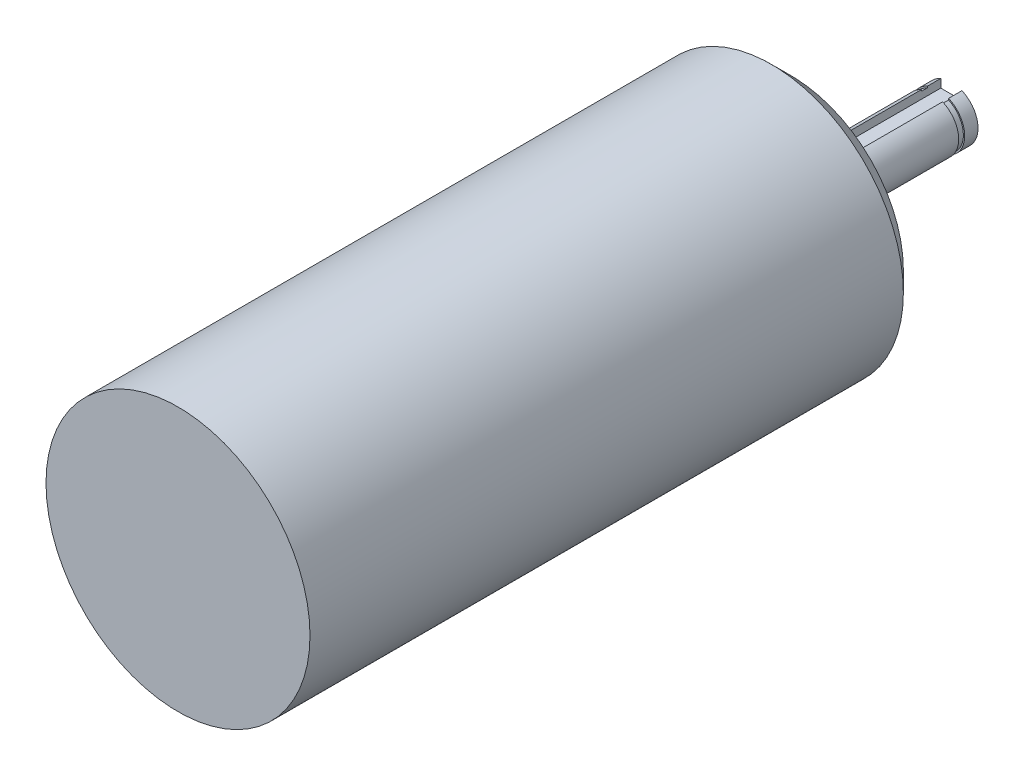
ISO-10303-21;
HEADER;
FILE_DESCRIPTION(('STEP AP214'),'2;1');
FILE_NAME('part.step','',(''),(''),'','','');
FILE_SCHEMA(('AUTOMOTIVE_DESIGN { 1 0 10303 214 1 1 1 1 }'));
ENDSEC;
DATA;
#1=APPLICATION_CONTEXT('core data for automotive mechanical design processes');
#2=APPLICATION_PROTOCOL_DEFINITION('international standard','automotive_design',2000,#1);
#3=PRODUCT_CONTEXT('',#1,'mechanical');
#4=PRODUCT('Part','Part','',(#3));
#5=PRODUCT_RELATED_PRODUCT_CATEGORY('part','',(#4));
#6=PRODUCT_DEFINITION_FORMATION('','',#4);
#7=PRODUCT_DEFINITION_CONTEXT('part definition',#1,'design');
#8=PRODUCT_DEFINITION('design','',#6,#7);
#9=PRODUCT_DEFINITION_SHAPE('','',#8);
#10=(LENGTH_UNIT() NAMED_UNIT(*) SI_UNIT(.MILLI.,.METRE.));
#11=(NAMED_UNIT(*) PLANE_ANGLE_UNIT() SI_UNIT($,.RADIAN.));
#12=(NAMED_UNIT(*) SI_UNIT($,.STERADIAN.) SOLID_ANGLE_UNIT());
#13=UNCERTAINTY_MEASURE_WITH_UNIT(LENGTH_MEASURE(1.E-05),#10,'distance_accuracy_value','');
#14=(GEOMETRIC_REPRESENTATION_CONTEXT(3) GLOBAL_UNCERTAINTY_ASSIGNED_CONTEXT((#13)) GLOBAL_UNIT_ASSIGNED_CONTEXT((#10,
#11,#12)) REPRESENTATION_CONTEXT('',''));
#15=CARTESIAN_POINT('',(0.,0.,0.));
#16=DIRECTION('',(0.,0.,1.));
#17=DIRECTION('',(1.,0.,0.));
#18=AXIS2_PLACEMENT_3D('',#15,#16,#17);
#19=CARTESIAN_POINT('',(0.,0.,-24.));
#20=DIRECTION('',(0.,0.,1.));
#21=DIRECTION('',(1.,0.,0.));
#22=AXIS2_PLACEMENT_3D('',#19,#20,#21);
#23=CYLINDRICAL_SURFACE('',#22,4.);
#24=CARTESIAN_POINT('',(0.,0.,0.));
#25=DIRECTION('',(0.,0.,-1.));
#26=DIRECTION('',(-1.,0.,0.));
#27=AXIS2_PLACEMENT_3D('',#24,#25,#26);
#28=CIRCLE('',#27,4.);
#29=CARTESIAN_POINT('',(-4.,0.,0.));
#30=VERTEX_POINT('',#29);
#31=EDGE_CURVE('E182',#30,#30,#28,.T.);
#32=ORIENTED_EDGE('',*,*,#31,.T.);
#33=EDGE_LOOP('',(#32));
#34=FACE_BOUND('',#33,.T.);
#35=CARTESIAN_POINT('',(0.,0.,-21.1));
#36=DIRECTION('',(0.,0.,-1.));
#37=DIRECTION('',(-1.,0.,0.));
#38=AXIS2_PLACEMENT_3D('',#35,#36,#37);
#39=CIRCLE('',#38,4.);
#40=CARTESIAN_POINT('',(1.5875,3.67149067137586,-21.1));
#41=VERTEX_POINT('',#40);
#42=CARTESIAN_POINT('',(-1.5875,3.67149067137586,-21.1));
#43=VERTEX_POINT('',#42);
#44=EDGE_CURVE('E128',#41,#43,#39,.T.);
#45=ORIENTED_EDGE('',*,*,#44,.F.);
#46=DIRECTION('',(0.,0.,1.));
#47=VECTOR('',#46,1.);
#48=CARTESIAN_POINT('',(1.5875,3.67149067137587,-24.));
#49=LINE('',#48,#47);
#50=CARTESIAN_POINT('',(1.5875,3.67149067137586,-5.));
#51=VERTEX_POINT('',#50);
#52=EDGE_CURVE('E166',#41,#51,#49,.T.);
#53=ORIENTED_EDGE('',*,*,#52,.T.);
#54=CARTESIAN_POINT('',(0.,0.,-5.));
#55=DIRECTION('',(0.,0.,1.));
#56=DIRECTION('',(1.,0.,0.));
#57=AXIS2_PLACEMENT_3D('',#54,#55,#56);
#58=CIRCLE('',#57,4.);
#59=CARTESIAN_POINT('',(-1.5875,3.67149067137586,-5.));
#60=VERTEX_POINT('',#59);
#61=EDGE_CURVE('E163',#51,#60,#58,.T.);
#62=ORIENTED_EDGE('',*,*,#61,.T.);
#63=DIRECTION('',(0.,0.,1.));
#64=VECTOR('',#63,1.);
#65=CARTESIAN_POINT('',(-1.5875,3.67149067137586,-24.));
#66=LINE('',#65,#64);
#67=EDGE_CURVE('E172',#60,#43,#66,.F.);
#68=ORIENTED_EDGE('',*,*,#67,.T.);
#69=EDGE_LOOP('',(#45,#53,#62,#68));
#70=FACE_BOUND('',#69,.T.);
#71=ADVANCED_FACE('F44',(#34,#70),#23,.T.);
#72=CARTESIAN_POINT('',(-1.5875,2.4125,-5.));
#73=DIRECTION('',(-1.,0.,0.));
#74=DIRECTION('',(0.,0.,1.));
#75=AXIS2_PLACEMENT_3D('',#72,#73,#74);
#76=PLANE('',#75);
#77=DIRECTION('',(0.,-1.,0.));
#78=VECTOR('',#77,1.);
#79=CARTESIAN_POINT('',(-1.5875,2.4125,-21.1));
#80=LINE('',#79,#78);
#81=CARTESIAN_POINT('',(-1.5875,3.45251267195357,-21.1));
#82=VERTEX_POINT('',#81);
#83=EDGE_CURVE('E123',#43,#82,#80,.T.);
#84=ORIENTED_EDGE('',*,*,#83,.F.);
#85=ORIENTED_EDGE('',*,*,#67,.F.);
#86=DIRECTION('',(0.,1.,0.));
#87=VECTOR('',#86,1.);
#88=CARTESIAN_POINT('',(-1.5875,2.4125,-5.));
#89=LINE('',#88,#87);
#90=CARTESIAN_POINT('',(-1.5875,2.4125,-5.));
#91=VERTEX_POINT('',#90);
#92=EDGE_CURVE('E151',#91,#60,#89,.T.);
#93=ORIENTED_EDGE('',*,*,#92,.F.);
#94=DIRECTION('',(0.,0.,-1.));
#95=VECTOR('',#94,1.);
#96=CARTESIAN_POINT('',(-1.5875,2.4125,-5.));
#97=LINE('',#96,#95);
#98=CARTESIAN_POINT('',(-1.5875,2.4125,-24.));
#99=VERTEX_POINT('',#98);
#100=EDGE_CURVE('E170',#91,#99,#97,.T.);
#101=ORIENTED_EDGE('',*,*,#100,.T.);
#102=DIRECTION('',(0.,1.,0.));
#103=VECTOR('',#102,1.);
#104=CARTESIAN_POINT('',(-1.5875,2.4125,-24.));
#105=LINE('',#104,#103);
#106=CARTESIAN_POINT('',(-1.5875,3.67149067137586,-24.));
#107=VERTEX_POINT('',#106);
#108=EDGE_CURVE('E134',#99,#107,#105,.T.);
#109=ORIENTED_EDGE('',*,*,#108,.T.);
#110=CARTESIAN_POINT('',(-1.5875,3.67149067137586,-22.));
#111=VERTEX_POINT('',#110);
#112=EDGE_CURVE('E174',#111,#107,#66,.F.);
#113=ORIENTED_EDGE('',*,*,#112,.F.);
#114=DIRECTION('',(0.,-1.,0.));
#115=VECTOR('',#114,1.);
#116=CARTESIAN_POINT('',(-1.5875,2.4125,-22.));
#117=LINE('',#116,#115);
#118=CARTESIAN_POINT('',(-1.5875,3.45251267195357,-22.));
#119=VERTEX_POINT('',#118);
#120=EDGE_CURVE('E132',#111,#119,#117,.T.);
#121=ORIENTED_EDGE('',*,*,#120,.T.);
#122=DIRECTION('',(0.,0.,-1.));
#123=VECTOR('',#122,1.);
#124=CARTESIAN_POINT('',(-1.5875,3.45251267195357,-21.1));
#125=LINE('',#124,#123);
#126=EDGE_CURVE('E139',#82,#119,#125,.T.);
#127=ORIENTED_EDGE('',*,*,#126,.F.);
#128=EDGE_LOOP('',(#84,#85,#93,#101,#109,#113,#121,#127));
#129=FACE_BOUND('',#128,.T.);
#130=ADVANCED_FACE('F145',(#129),#76,.F.);
#131=CARTESIAN_POINT('',(1.5875,2.4125,-5.));
#132=DIRECTION('',(1.,0.,0.));
#133=DIRECTION('',(0.,0.,-1.));
#134=AXIS2_PLACEMENT_3D('',#131,#132,#133);
#135=PLANE('',#134);
#136=DIRECTION('',(0.,1.,0.));
#137=VECTOR('',#136,1.);
#138=CARTESIAN_POINT('',(1.5875,2.4125,-21.1));
#139=LINE('',#138,#137);
#140=CARTESIAN_POINT('',(1.5875,3.45251267195357,-21.1));
#141=VERTEX_POINT('',#140);
#142=EDGE_CURVE('E11',#141,#41,#139,.T.);
#143=ORIENTED_EDGE('',*,*,#142,.F.);
#144=DIRECTION('',(0.,0.,-1.));
#145=VECTOR('',#144,1.);
#146=CARTESIAN_POINT('',(1.5875,3.45251267195357,-21.1));
#147=LINE('',#146,#145);
#148=CARTESIAN_POINT('',(1.5875,3.45251267195357,-22.));
#149=VERTEX_POINT('',#148);
#150=EDGE_CURVE('E140',#149,#141,#147,.F.);
#151=ORIENTED_EDGE('',*,*,#150,.F.);
#152=DIRECTION('',(0.,1.,0.));
#153=VECTOR('',#152,1.);
#154=CARTESIAN_POINT('',(1.5875,2.4125,-22.));
#155=LINE('',#154,#153);
#156=CARTESIAN_POINT('',(1.5875,3.67149067137586,-22.));
#157=VERTEX_POINT('',#156);
#158=EDGE_CURVE('E53',#149,#157,#155,.T.);
#159=ORIENTED_EDGE('',*,*,#158,.T.);
#160=CARTESIAN_POINT('',(1.5875,3.67149067137586,-24.));
#161=VERTEX_POINT('',#160);
#162=EDGE_CURVE('E173',#161,#157,#49,.T.);
#163=ORIENTED_EDGE('',*,*,#162,.F.);
#164=DIRECTION('',(0.,-1.,0.));
#165=VECTOR('',#164,1.);
#166=CARTESIAN_POINT('',(1.5875,2.4125,-24.));
#167=LINE('',#166,#165);
#168=CARTESIAN_POINT('',(1.5875,2.4125,-24.));
#169=VERTEX_POINT('',#168);
#170=EDGE_CURVE('E165',#161,#169,#167,.T.);
#171=ORIENTED_EDGE('',*,*,#170,.T.);
#172=DIRECTION('',(0.,0.,-1.));
#173=VECTOR('',#172,1.);
#174=CARTESIAN_POINT('',(1.5875,2.4125,-5.));
#175=LINE('',#174,#173);
#176=CARTESIAN_POINT('',(1.5875,2.4125,-5.));
#177=VERTEX_POINT('',#176);
#178=EDGE_CURVE('E68',#177,#169,#175,.T.);
#179=ORIENTED_EDGE('',*,*,#178,.F.);
#180=DIRECTION('',(0.,-1.,0.));
#181=VECTOR('',#180,1.);
#182=CARTESIAN_POINT('',(1.5875,2.4125,-5.));
#183=LINE('',#182,#181);
#184=EDGE_CURVE('E152',#51,#177,#183,.T.);
#185=ORIENTED_EDGE('',*,*,#184,.F.);
#186=ORIENTED_EDGE('',*,*,#52,.F.);
#187=EDGE_LOOP('',(#143,#151,#159,#163,#171,#179,#185,#186));
#188=FACE_BOUND('',#187,.T.);
#189=ADVANCED_FACE('F231',(#188),#135,.F.);
#190=CARTESIAN_POINT('',(0.,0.,92.));
#191=DIRECTION('',(0.,0.,-1.));
#192=DIRECTION('',(-1.,0.,0.));
#193=AXIS2_PLACEMENT_3D('',#190,#191,#192);
#194=CYLINDRICAL_SURFACE('',#193,19.8);
#195=CARTESIAN_POINT('',(0.,0.,3.00000000000002));
#196=DIRECTION('',(0.,0.,1.));
#197=DIRECTION('',(1.,0.,0.));
#198=AXIS2_PLACEMENT_3D('',#195,#196,#197);
#199=CIRCLE('',#198,19.8);
#200=CARTESIAN_POINT('',(19.8,0.,3.00000000000002));
#201=VERTEX_POINT('',#200);
#202=EDGE_CURVE('E184',#201,#201,#199,.T.);
#203=ORIENTED_EDGE('',*,*,#202,.T.);
#204=EDGE_LOOP('',(#203));
#205=FACE_BOUND('',#204,.T.);
#206=CARTESIAN_POINT('',(0.,0.,92.));
#207=DIRECTION('',(0.,0.,1.));
#208=DIRECTION('',(1.,0.,0.));
#209=AXIS2_PLACEMENT_3D('',#206,#207,#208);
#210=CIRCLE('',#209,19.8);
#211=CARTESIAN_POINT('',(19.8,0.,92.));
#212=VERTEX_POINT('',#211);
#213=EDGE_CURVE('E183',#212,#212,#210,.T.);
#214=ORIENTED_EDGE('',*,*,#213,.F.);
#215=EDGE_LOOP('',(#214));
#216=FACE_BOUND('',#215,.T.);
#217=ADVANCED_FACE('F322',(#205,#216),#194,.T.);
#218=CARTESIAN_POINT('',(0.,0.,92.));
#219=DIRECTION('',(0.,0.,1.));
#220=DIRECTION('',(1.,0.,0.));
#221=AXIS2_PLACEMENT_3D('',#218,#219,#220);
#222=PLANE('',#221);
#223=ORIENTED_EDGE('',*,*,#213,.T.);
#224=EDGE_LOOP('',(#223));
#225=FACE_BOUND('',#224,.T.);
#226=ADVANCED_FACE('F321',(#225),#222,.T.);
#227=CARTESIAN_POINT('',(0.,0.,0.));
#228=DIRECTION('',(0.,0.,1.));
#229=DIRECTION('',(1.,0.,0.));
#230=AXIS2_PLACEMENT_3D('',#227,#228,#229);
#231=PLANE('',#230);
#232=CARTESIAN_POINT('',(0.,0.,0.));
#233=DIRECTION('',(0.,0.,1.));
#234=DIRECTION('',(1.,0.,0.));
#235=AXIS2_PLACEMENT_3D('',#232,#233,#234);
#236=CIRCLE('',#235,16.8);
#237=CARTESIAN_POINT('',(16.8,0.,0.));
#238=VERTEX_POINT('',#237);
#239=EDGE_CURVE('E164',#238,#238,#236,.F.);
#240=ORIENTED_EDGE('',*,*,#239,.T.);
#241=EDGE_LOOP('',(#240));
#242=FACE_BOUND('',#241,.T.);
#243=ORIENTED_EDGE('',*,*,#31,.F.);
#244=EDGE_LOOP('',(#243));
#245=FACE_BOUND('',#244,.T.);
#246=CARTESIAN_POINT('',(0.,12.5,0.));
#247=DIRECTION('',(0.,0.,-1.));
#248=DIRECTION('',(-1.,0.,0.));
#249=AXIS2_PLACEMENT_3D('',#246,#247,#248);
#250=CIRCLE('',#249,2.025);
#251=CARTESIAN_POINT('',(-2.025,12.5,0.));
#252=VERTEX_POINT('',#251);
#253=EDGE_CURVE('E180',#252,#252,#250,.T.);
#254=ORIENTED_EDGE('',*,*,#253,.F.);
#255=EDGE_LOOP('',(#254));
#256=FACE_BOUND('',#255,.T.);
#257=CARTESIAN_POINT('',(12.5,0.,0.));
#258=DIRECTION('',(0.,0.,-1.));
#259=DIRECTION('',(-1.,0.,0.));
#260=AXIS2_PLACEMENT_3D('',#257,#258,#259);
#261=CIRCLE('',#260,2.025);
#262=CARTESIAN_POINT('',(10.475,0.,0.));
#263=VERTEX_POINT('',#262);
#264=EDGE_CURVE('E193',#263,#263,#261,.T.);
#265=ORIENTED_EDGE('',*,*,#264,.F.);
#266=EDGE_LOOP('',(#265));
#267=FACE_BOUND('',#266,.T.);
#268=CARTESIAN_POINT('',(0.,-12.5,0.));
#269=DIRECTION('',(0.,0.,-1.));
#270=DIRECTION('',(-1.,0.,0.));
#271=AXIS2_PLACEMENT_3D('',#268,#269,#270);
#272=CIRCLE('',#271,2.025);
#273=CARTESIAN_POINT('',(-2.025,-12.5,0.));
#274=VERTEX_POINT('',#273);
#275=EDGE_CURVE('E201',#274,#274,#272,.T.);
#276=ORIENTED_EDGE('',*,*,#275,.F.);
#277=EDGE_LOOP('',(#276));
#278=FACE_BOUND('',#277,.T.);
#279=CARTESIAN_POINT('',(-12.5,0.,0.));
#280=DIRECTION('',(0.,0.,-1.));
#281=DIRECTION('',(-1.,0.,0.));
#282=AXIS2_PLACEMENT_3D('',#279,#280,#281);
#283=CIRCLE('',#282,2.025);
#284=CARTESIAN_POINT('',(-14.525,0.,0.));
#285=VERTEX_POINT('',#284);
#286=EDGE_CURVE('E215',#285,#285,#283,.T.);
#287=ORIENTED_EDGE('',*,*,#286,.F.);
#288=EDGE_LOOP('',(#287));
#289=FACE_BOUND('',#288,.T.);
#290=ADVANCED_FACE('F317',(#242,#245,#256,#267,#278,#289),#231,.F.);
#291=CARTESIAN_POINT('',(-12.5,0.,4.));
#292=DIRECTION('',(0.,0.,-1.));
#293=DIRECTION('',(-1.,0.,0.));
#294=AXIS2_PLACEMENT_3D('',#291,#292,#293);
#295=CONICAL_SURFACE('',#294,1.65,1.02974425867665);
#296=CARTESIAN_POINT('',(-12.5,0.,4.99142002139547));
#297=VERTEX_POINT('',#296);
#298=VERTEX_LOOP('',#297);
#299=FACE_BOUND('',#298,.T.);
#300=CARTESIAN_POINT('',(-12.5,0.,4.));
#301=DIRECTION('',(0.,0.,-1.));
#302=DIRECTION('',(-1.,0.,0.));
#303=AXIS2_PLACEMENT_3D('',#300,#301,#302);
#304=CIRCLE('',#303,1.65);
#305=CARTESIAN_POINT('',(-14.15,0.,4.));
#306=VERTEX_POINT('',#305);
#307=EDGE_CURVE('E217',#306,#306,#304,.T.);
#308=ORIENTED_EDGE('',*,*,#307,.T.);
#309=EDGE_LOOP('',(#308));
#310=FACE_BOUND('',#309,.T.);
#311=ADVANCED_FACE('F312',(#299,#310),#295,.F.);
#312=CARTESIAN_POINT('',(-12.5,0.,0.));
#313=DIRECTION('',(0.,0.,-1.));
#314=DIRECTION('',(-1.,0.,0.));
#315=AXIS2_PLACEMENT_3D('',#312,#313,#314);
#316=CYLINDRICAL_SURFACE('',#315,1.65);
#317=ORIENTED_EDGE('',*,*,#307,.F.);
#318=EDGE_LOOP('',(#317));
#319=FACE_BOUND('',#318,.T.);
#320=CARTESIAN_POINT('',(-12.5,0.,0.375000000000001));
#321=DIRECTION('',(0.,0.,-1.));
#322=DIRECTION('',(-1.,0.,0.));
#323=AXIS2_PLACEMENT_3D('',#320,#321,#322);
#324=CIRCLE('',#323,1.65);
#325=CARTESIAN_POINT('',(-14.15,0.,0.375000000000001));
#326=VERTEX_POINT('',#325);
#327=EDGE_CURVE('E214',#326,#326,#324,.T.);
#328=ORIENTED_EDGE('',*,*,#327,.T.);
#329=EDGE_LOOP('',(#328));
#330=FACE_BOUND('',#329,.T.);
#331=ADVANCED_FACE('F313',(#319,#330),#316,.F.);
#332=CARTESIAN_POINT('',(-12.5,0.,0.));
#333=DIRECTION('',(0.,0.,-1.));
#334=DIRECTION('',(-1.,0.,0.));
#335=AXIS2_PLACEMENT_3D('',#332,#333,#334);
#336=CONICAL_SURFACE('',#335,2.025,0.785398163397448);
#337=ORIENTED_EDGE('',*,*,#327,.F.);
#338=EDGE_LOOP('',(#337));
#339=FACE_BOUND('',#338,.T.);
#340=ORIENTED_EDGE('',*,*,#286,.T.);
#341=EDGE_LOOP('',(#340));
#342=FACE_BOUND('',#341,.T.);
#343=ADVANCED_FACE('F307',(#339,#342),#336,.F.);
#344=CARTESIAN_POINT('',(0.,-12.5,4.));
#345=DIRECTION('',(0.,0.,-1.));
#346=DIRECTION('',(-1.,0.,0.));
#347=AXIS2_PLACEMENT_3D('',#344,#345,#346);
#348=CONICAL_SURFACE('',#347,1.65,1.02974425867665);
#349=CARTESIAN_POINT('',(0.,-12.5,4.99142002139547));
#350=VERTEX_POINT('',#349);
#351=VERTEX_LOOP('',#350);
#352=FACE_BOUND('',#351,.T.);
#353=CARTESIAN_POINT('',(0.,-12.5,4.));
#354=DIRECTION('',(0.,0.,-1.));
#355=DIRECTION('',(-1.,0.,0.));
#356=AXIS2_PLACEMENT_3D('',#353,#354,#355);
#357=CIRCLE('',#356,1.65);
#358=CARTESIAN_POINT('',(-1.65,-12.5,4.));
#359=VERTEX_POINT('',#358);
#360=EDGE_CURVE('E207',#359,#359,#357,.T.);
#361=ORIENTED_EDGE('',*,*,#360,.T.);
#362=EDGE_LOOP('',(#361));
#363=FACE_BOUND('',#362,.T.);
#364=ADVANCED_FACE('F304',(#352,#363),#348,.F.);
#365=CARTESIAN_POINT('',(0.,-12.5,0.));
#366=DIRECTION('',(0.,0.,-1.));
#367=DIRECTION('',(-1.,0.,0.));
#368=AXIS2_PLACEMENT_3D('',#365,#366,#367);
#369=CYLINDRICAL_SURFACE('',#368,1.65);
#370=ORIENTED_EDGE('',*,*,#360,.F.);
#371=EDGE_LOOP('',(#370));
#372=FACE_BOUND('',#371,.T.);
#373=CARTESIAN_POINT('',(0.,-12.5,0.375000000000001));
#374=DIRECTION('',(0.,0.,-1.));
#375=DIRECTION('',(-1.,0.,0.));
#376=AXIS2_PLACEMENT_3D('',#373,#374,#375);
#377=CIRCLE('',#376,1.65);
#378=CARTESIAN_POINT('',(-1.65,-12.5,0.375000000000001));
#379=VERTEX_POINT('',#378);
#380=EDGE_CURVE('E206',#379,#379,#377,.T.);
#381=ORIENTED_EDGE('',*,*,#380,.T.);
#382=EDGE_LOOP('',(#381));
#383=FACE_BOUND('',#382,.T.);
#384=ADVANCED_FACE('F299',(#372,#383),#369,.F.);
#385=CARTESIAN_POINT('',(0.,-12.5,0.));
#386=DIRECTION('',(0.,0.,-1.));
#387=DIRECTION('',(-1.,0.,0.));
#388=AXIS2_PLACEMENT_3D('',#385,#386,#387);
#389=CONICAL_SURFACE('',#388,2.025,0.785398163397448);
#390=ORIENTED_EDGE('',*,*,#380,.F.);
#391=EDGE_LOOP('',(#390));
#392=FACE_BOUND('',#391,.T.);
#393=ORIENTED_EDGE('',*,*,#275,.T.);
#394=EDGE_LOOP('',(#393));
#395=FACE_BOUND('',#394,.T.);
#396=ADVANCED_FACE('F293',(#392,#395),#389,.F.);
#397=CARTESIAN_POINT('',(12.5,0.,4.));
#398=DIRECTION('',(0.,0.,-1.));
#399=DIRECTION('',(-1.,0.,0.));
#400=AXIS2_PLACEMENT_3D('',#397,#398,#399);
#401=CONICAL_SURFACE('',#400,1.65,1.02974425867665);
#402=CARTESIAN_POINT('',(12.5,0.,4.99142002139547));
#403=VERTEX_POINT('',#402);
#404=VERTEX_LOOP('',#403);
#405=FACE_BOUND('',#404,.T.);
#406=CARTESIAN_POINT('',(12.5,0.,4.));
#407=DIRECTION('',(0.,0.,-1.));
#408=DIRECTION('',(-1.,0.,0.));
#409=AXIS2_PLACEMENT_3D('',#406,#407,#408);
#410=CIRCLE('',#409,1.65);
#411=CARTESIAN_POINT('',(10.85,0.,4.));
#412=VERTEX_POINT('',#411);
#413=EDGE_CURVE('E199',#412,#412,#410,.T.);
#414=ORIENTED_EDGE('',*,*,#413,.T.);
#415=EDGE_LOOP('',(#414));
#416=FACE_BOUND('',#415,.T.);
#417=ADVANCED_FACE('F292',(#405,#416),#401,.F.);
#418=CARTESIAN_POINT('',(12.5,0.,0.));
#419=DIRECTION('',(0.,0.,-1.));
#420=DIRECTION('',(-1.,0.,0.));
#421=AXIS2_PLACEMENT_3D('',#418,#419,#420);
#422=CYLINDRICAL_SURFACE('',#421,1.65);
#423=ORIENTED_EDGE('',*,*,#413,.F.);
#424=EDGE_LOOP('',(#423));
#425=FACE_BOUND('',#424,.T.);
#426=CARTESIAN_POINT('',(12.5,0.,0.375000000000001));
#427=DIRECTION('',(0.,0.,-1.));
#428=DIRECTION('',(-1.,0.,0.));
#429=AXIS2_PLACEMENT_3D('',#426,#427,#428);
#430=CIRCLE('',#429,1.65);
#431=CARTESIAN_POINT('',(10.85,0.,0.375000000000001));
#432=VERTEX_POINT('',#431);
#433=EDGE_CURVE('E197',#432,#432,#430,.T.);
#434=ORIENTED_EDGE('',*,*,#433,.T.);
#435=EDGE_LOOP('',(#434));
#436=FACE_BOUND('',#435,.T.);
#437=ADVANCED_FACE('F287',(#425,#436),#422,.F.);
#438=CARTESIAN_POINT('',(12.5,0.,0.));
#439=DIRECTION('',(0.,0.,-1.));
#440=DIRECTION('',(-1.,0.,0.));
#441=AXIS2_PLACEMENT_3D('',#438,#439,#440);
#442=CONICAL_SURFACE('',#441,2.025,0.785398163397448);
#443=ORIENTED_EDGE('',*,*,#433,.F.);
#444=EDGE_LOOP('',(#443));
#445=FACE_BOUND('',#444,.T.);
#446=ORIENTED_EDGE('',*,*,#264,.T.);
#447=EDGE_LOOP('',(#446));
#448=FACE_BOUND('',#447,.T.);
#449=ADVANCED_FACE('F281',(#445,#448),#442,.F.);
#450=CARTESIAN_POINT('',(0.,12.5,4.));
#451=DIRECTION('',(0.,0.,-1.));
#452=DIRECTION('',(-1.,0.,0.));
#453=AXIS2_PLACEMENT_3D('',#450,#451,#452);
#454=CONICAL_SURFACE('',#453,1.65,1.02974425867665);
#455=CARTESIAN_POINT('',(0.,12.5,4.99142002139547));
#456=VERTEX_POINT('',#455);
#457=VERTEX_LOOP('',#456);
#458=FACE_BOUND('',#457,.T.);
#459=CARTESIAN_POINT('',(0.,12.5,4.));
#460=DIRECTION('',(0.,0.,-1.));
#461=DIRECTION('',(-1.,0.,0.));
#462=AXIS2_PLACEMENT_3D('',#459,#460,#461);
#463=CIRCLE('',#462,1.65);
#464=CARTESIAN_POINT('',(-1.65,12.5,4.));
#465=VERTEX_POINT('',#464);
#466=EDGE_CURVE('E191',#465,#465,#463,.T.);
#467=ORIENTED_EDGE('',*,*,#466,.T.);
#468=EDGE_LOOP('',(#467));
#469=FACE_BOUND('',#468,.T.);
#470=ADVANCED_FACE('F274',(#458,#469),#454,.F.);
#471=CARTESIAN_POINT('',(0.,12.5,0.));
#472=DIRECTION('',(0.,0.,-1.));
#473=DIRECTION('',(-1.,0.,0.));
#474=AXIS2_PLACEMENT_3D('',#471,#472,#473);
#475=CYLINDRICAL_SURFACE('',#474,1.65);
#476=ORIENTED_EDGE('',*,*,#466,.F.);
#477=EDGE_LOOP('',(#476));
#478=FACE_BOUND('',#477,.T.);
#479=CARTESIAN_POINT('',(0.,12.5,0.375000000000001));
#480=DIRECTION('',(0.,0.,-1.));
#481=DIRECTION('',(-1.,0.,0.));
#482=AXIS2_PLACEMENT_3D('',#479,#480,#481);
#483=CIRCLE('',#482,1.65);
#484=CARTESIAN_POINT('',(-1.65,12.5,0.375000000000001));
#485=VERTEX_POINT('',#484);
#486=EDGE_CURVE('E186',#485,#485,#483,.T.);
#487=ORIENTED_EDGE('',*,*,#486,.T.);
#488=EDGE_LOOP('',(#487));
#489=FACE_BOUND('',#488,.T.);
#490=ADVANCED_FACE('F268',(#478,#489),#475,.F.);
#491=CARTESIAN_POINT('',(0.,12.5,0.));
#492=DIRECTION('',(0.,0.,-1.));
#493=DIRECTION('',(-1.,0.,0.));
#494=AXIS2_PLACEMENT_3D('',#491,#492,#493);
#495=CONICAL_SURFACE('',#494,2.025,0.785398163397448);
#496=ORIENTED_EDGE('',*,*,#486,.F.);
#497=EDGE_LOOP('',(#496));
#498=FACE_BOUND('',#497,.T.);
#499=ORIENTED_EDGE('',*,*,#253,.T.);
#500=EDGE_LOOP('',(#499));
#501=FACE_BOUND('',#500,.T.);
#502=ADVANCED_FACE('F261',(#498,#501),#495,.F.);
#503=ORIENTED_EDGE('',*,*,#162,.T.);
#504=CARTESIAN_POINT('',(0.,0.,-22.));
#505=DIRECTION('',(0.,0.,-1.));
#506=DIRECTION('',(-1.,0.,0.));
#507=AXIS2_PLACEMENT_3D('',#504,#505,#506);
#508=CIRCLE('',#507,4.);
#509=EDGE_CURVE('E143',#157,#111,#508,.T.);
#510=ORIENTED_EDGE('',*,*,#509,.T.);
#511=ORIENTED_EDGE('',*,*,#112,.T.);
#512=CARTESIAN_POINT('',(0.,0.,-24.));
#513=DIRECTION('',(0.,0.,-1.));
#514=DIRECTION('',(-1.,0.,0.));
#515=AXIS2_PLACEMENT_3D('',#512,#513,#514);
#516=CIRCLE('',#515,4.);
#517=EDGE_CURVE('E177',#161,#107,#516,.T.);
#518=ORIENTED_EDGE('',*,*,#517,.F.);
#519=EDGE_LOOP('',(#503,#510,#511,#518));
#520=FACE_BOUND('',#519,.T.);
#521=ADVANCED_FACE('F240',(#520),#23,.T.);
#522=CARTESIAN_POINT('',(0.,0.,-24.));
#523=DIRECTION('',(0.,0.,-1.));
#524=DIRECTION('',(-1.,0.,0.));
#525=AXIS2_PLACEMENT_3D('',#522,#523,#524);
#526=PLANE('',#525);
#527=ORIENTED_EDGE('',*,*,#108,.F.);
#528=DIRECTION('',(-1.,0.,0.));
#529=VECTOR('',#528,1.);
#530=CARTESIAN_POINT('',(1.5875,2.4125,-24.));
#531=LINE('',#530,#529);
#532=EDGE_CURVE('E154',#169,#99,#531,.T.);
#533=ORIENTED_EDGE('',*,*,#532,.F.);
#534=ORIENTED_EDGE('',*,*,#170,.F.);
#535=ORIENTED_EDGE('',*,*,#517,.T.);
#536=EDGE_LOOP('',(#527,#533,#534,#535));
#537=FACE_BOUND('',#536,.T.);
#538=ADVANCED_FACE('F238',(#537),#526,.T.);
#539=CARTESIAN_POINT('',(0.,0.,3.00000000000002));
#540=DIRECTION('',(0.,0.,1.));
#541=DIRECTION('',(1.,0.,0.));
#542=AXIS2_PLACEMENT_3D('',#539,#540,#541);
#543=CONICAL_SURFACE('',#542,19.8,0.785398163397451);
#544=ORIENTED_EDGE('',*,*,#239,.F.);
#545=EDGE_LOOP('',(#544));
#546=FACE_BOUND('',#545,.T.);
#547=ORIENTED_EDGE('',*,*,#202,.F.);
#548=EDGE_LOOP('',(#547));
#549=FACE_BOUND('',#548,.T.);
#550=ADVANCED_FACE('F48',(#546,#549),#543,.T.);
#551=CARTESIAN_POINT('',(0.,0.,-5.));
#552=DIRECTION('',(0.,0.,1.));
#553=DIRECTION('',(1.,0.,0.));
#554=AXIS2_PLACEMENT_3D('',#551,#552,#553);
#555=PLANE('',#554);
#556=ORIENTED_EDGE('',*,*,#184,.T.);
#557=DIRECTION('',(-1.,0.,0.));
#558=VECTOR('',#557,1.);
#559=CARTESIAN_POINT('',(1.5875,2.4125,-5.));
#560=LINE('',#559,#558);
#561=EDGE_CURVE('E160',#177,#91,#560,.T.);
#562=ORIENTED_EDGE('',*,*,#561,.T.);
#563=ORIENTED_EDGE('',*,*,#92,.T.);
#564=ORIENTED_EDGE('',*,*,#61,.F.);
#565=EDGE_LOOP('',(#556,#562,#563,#564));
#566=FACE_BOUND('',#565,.T.);
#567=ADVANCED_FACE('F247',(#566),#555,.F.);
#568=CARTESIAN_POINT('',(1.5875,2.4125,-5.));
#569=DIRECTION('',(0.,-1.,0.));
#570=DIRECTION('',(0.,0.,-1.));
#571=AXIS2_PLACEMENT_3D('',#568,#569,#570);
#572=PLANE('',#571);
#573=ORIENTED_EDGE('',*,*,#532,.T.);
#574=ORIENTED_EDGE('',*,*,#100,.F.);
#575=ORIENTED_EDGE('',*,*,#561,.F.);
#576=ORIENTED_EDGE('',*,*,#178,.T.);
#577=EDGE_LOOP('',(#573,#574,#575,#576));
#578=FACE_BOUND('',#577,.T.);
#579=ADVANCED_FACE('F244',(#578),#572,.F.);
#580=CARTESIAN_POINT('',(0.,0.,-21.1));
#581=DIRECTION('',(0.,0.,-1.));
#582=DIRECTION('',(-1.,0.,0.));
#583=AXIS2_PLACEMENT_3D('',#580,#581,#582);
#584=PLANE('',#583);
#585=ORIENTED_EDGE('',*,*,#83,.T.);
#586=CARTESIAN_POINT('',(0.,0.,-21.1));
#587=DIRECTION('',(0.,0.,-1.));
#588=DIRECTION('',(-1.,0.,0.));
#589=AXIS2_PLACEMENT_3D('',#586,#587,#588);
#590=CIRCLE('',#589,3.8);
#591=EDGE_CURVE('E130',#141,#82,#590,.T.);
#592=ORIENTED_EDGE('',*,*,#591,.F.);
#593=ORIENTED_EDGE('',*,*,#142,.T.);
#594=ORIENTED_EDGE('',*,*,#44,.T.);
#595=EDGE_LOOP('',(#585,#592,#593,#594));
#596=FACE_BOUND('',#595,.T.);
#597=ADVANCED_FACE('F127',(#596),#584,.T.);
#598=CARTESIAN_POINT('',(0.,0.,-22.));
#599=DIRECTION('',(0.,0.,-1.));
#600=DIRECTION('',(-1.,0.,0.));
#601=AXIS2_PLACEMENT_3D('',#598,#599,#600);
#602=PLANE('',#601);
#603=ORIENTED_EDGE('',*,*,#509,.F.);
#604=ORIENTED_EDGE('',*,*,#158,.F.);
#605=CARTESIAN_POINT('',(0.,0.,-22.));
#606=DIRECTION('',(0.,0.,-1.));
#607=DIRECTION('',(-1.,0.,0.));
#608=AXIS2_PLACEMENT_3D('',#605,#606,#607);
#609=CIRCLE('',#608,3.8);
#610=EDGE_CURVE('E63',#149,#119,#609,.T.);
#611=ORIENTED_EDGE('',*,*,#610,.T.);
#612=ORIENTED_EDGE('',*,*,#120,.F.);
#613=EDGE_LOOP('',(#603,#604,#611,#612));
#614=FACE_BOUND('',#613,.T.);
#615=ADVANCED_FACE('F363',(#614),#602,.F.);
#616=CARTESIAN_POINT('',(0.,0.,-21.1));
#617=DIRECTION('',(0.,0.,-1.));
#618=DIRECTION('',(-1.,0.,0.));
#619=AXIS2_PLACEMENT_3D('',#616,#617,#618);
#620=CYLINDRICAL_SURFACE('',#619,3.8);
#621=ORIENTED_EDGE('',*,*,#126,.T.);
#622=ORIENTED_EDGE('',*,*,#610,.F.);
#623=ORIENTED_EDGE('',*,*,#150,.T.);
#624=ORIENTED_EDGE('',*,*,#591,.T.);
#625=EDGE_LOOP('',(#621,#622,#623,#624));
#626=FACE_BOUND('',#625,.T.);
#627=ADVANCED_FACE('F137',(#626),#620,.T.);
#628=CLOSED_SHELL('',(#71,#130,#189,#217,#226,#290,#311,#331,#343,#364,#384,#396,#417,#437,#449,
#470,#490,#502,#521,#538,#550,#567,#579,#597,#615,#627));
#629=MANIFOLD_SOLID_BREP('B2',#628);
#630=ADVANCED_BREP_SHAPE_REPRESENTATION('',(#18,#629),#14);
#631=SHAPE_DEFINITION_REPRESENTATION(#9,#630);
ENDSEC;
END-ISO-10303-21;
